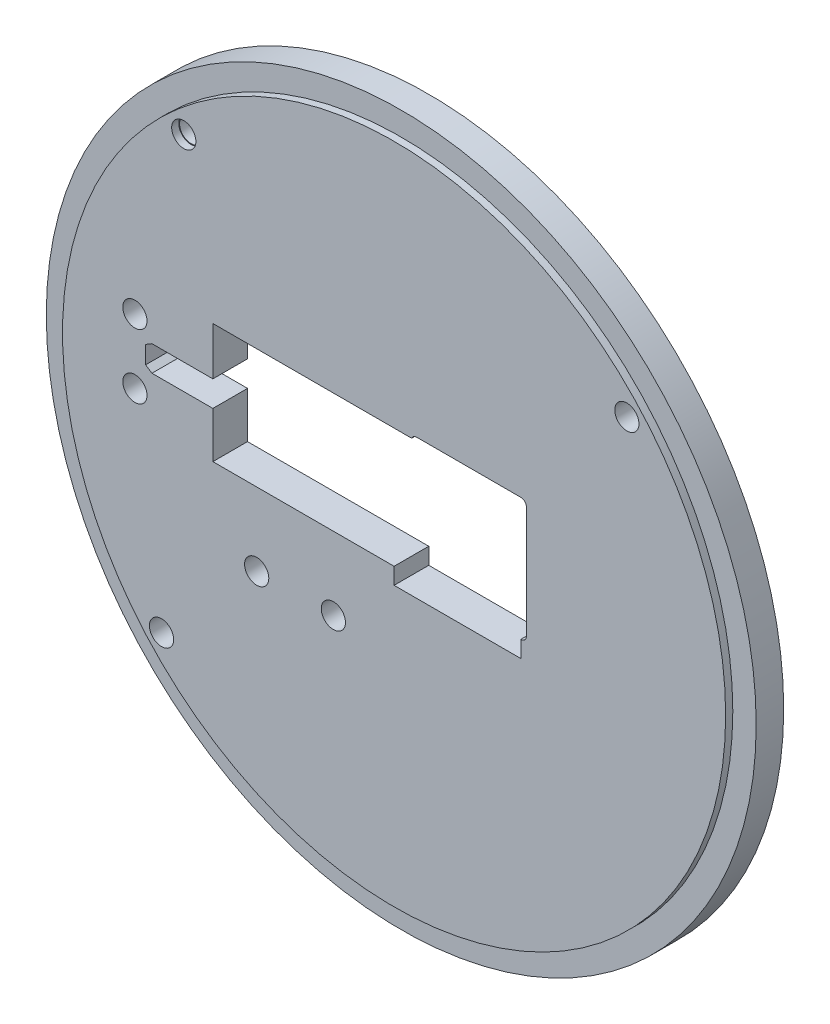
ISO-10303-21;
HEADER;
FILE_DESCRIPTION(('STEP AP214'),'2;1');
FILE_NAME('part.step','',(''),(''),'','','');
FILE_SCHEMA(('AUTOMOTIVE_DESIGN { 1 0 10303 214 1 1 1 1 }'));
ENDSEC;
DATA;
#1=APPLICATION_CONTEXT('core data for automotive mechanical design processes');
#2=APPLICATION_PROTOCOL_DEFINITION('international standard','automotive_design',2000,#1);
#3=PRODUCT_CONTEXT('',#1,'mechanical');
#4=PRODUCT('Part','Part','',(#3));
#5=PRODUCT_RELATED_PRODUCT_CATEGORY('part','',(#4));
#6=PRODUCT_DEFINITION_FORMATION('','',#4);
#7=PRODUCT_DEFINITION_CONTEXT('part definition',#1,'design');
#8=PRODUCT_DEFINITION('design','',#6,#7);
#9=PRODUCT_DEFINITION_SHAPE('','',#8);
#10=(LENGTH_UNIT() NAMED_UNIT(*) SI_UNIT(.MILLI.,.METRE.));
#11=(NAMED_UNIT(*) PLANE_ANGLE_UNIT() SI_UNIT($,.RADIAN.));
#12=(NAMED_UNIT(*) SI_UNIT($,.STERADIAN.) SOLID_ANGLE_UNIT());
#13=UNCERTAINTY_MEASURE_WITH_UNIT(LENGTH_MEASURE(1.E-05),#10,'distance_accuracy_value','');
#14=(GEOMETRIC_REPRESENTATION_CONTEXT(3) GLOBAL_UNCERTAINTY_ASSIGNED_CONTEXT((#13)) GLOBAL_UNIT_ASSIGNED_CONTEXT((#10,
#11,#12)) REPRESENTATION_CONTEXT('',''));
#15=CARTESIAN_POINT('',(0.,0.,0.));
#16=DIRECTION('',(0.,0.,1.));
#17=DIRECTION('',(1.,0.,0.));
#18=AXIS2_PLACEMENT_3D('',#15,#16,#17);
#19=CARTESIAN_POINT('',(0.,0.,1.3));
#20=DIRECTION('',(0.,0.,1.));
#21=DIRECTION('',(1.,0.,0.));
#22=AXIS2_PLACEMENT_3D('',#19,#20,#21);
#23=PLANE('',#22);
#24=DIRECTION('',(0.,-1.,0.));
#25=VECTOR('',#24,1.);
#26=CARTESIAN_POINT('',(-32.9284488261139,-6.63792462055282,1.3));
#27=LINE('',#26,#25);
#28=CARTESIAN_POINT('',(-32.9284488261139,15.1034870814472,1.3));
#29=VERTEX_POINT('',#28);
#30=CARTESIAN_POINT('',(-32.9284488261139,6.38776102905477,1.3));
#31=VERTEX_POINT('',#30);
#32=EDGE_CURVE('E156',#29,#31,#27,.T.);
#33=ORIENTED_EDGE('',*,*,#32,.F.);
#34=DIRECTION('',(-1.,0.,0.));
#35=VECTOR('',#34,1.);
#36=CARTESIAN_POINT('',(-4.87541319811387,15.1034870814472,1.3));
#37=LINE('',#36,#35);
#38=CARTESIAN_POINT('',(3.18719167966723,15.1034870814472,1.3));
#39=VERTEX_POINT('',#38);
#40=EDGE_CURVE('E160',#39,#29,#37,.T.);
#41=ORIENTED_EDGE('',*,*,#40,.F.);
#42=CARTESIAN_POINT('',(4.13147814388534,14.6913666814466,1.3));
#43=DIRECTION('',(0.,0.,1.));
#44=DIRECTION('',(-1.,0.,0.));
#45=AXIS2_PLACEMENT_3D('',#42,#43,#44);
#46=CIRCLE('',#45,1.03030100000056);
#47=CARTESIAN_POINT('',(4.13147814388613,15.7216676814472,1.3));
#48=VERTEX_POINT('',#47);
#49=EDGE_CURVE('E177',#48,#39,#46,.T.);
#50=ORIENTED_EDGE('',*,*,#49,.F.);
#51=DIRECTION('',(-1.,0.,0.));
#52=VECTOR('',#51,1.);
#53=CARTESIAN_POINT('',(4.13147814388613,15.7216676814472,1.3));
#54=LINE('',#53,#52);
#55=CARTESIAN_POINT('',(23.0168954738861,15.7216676814472,1.3));
#56=VERTEX_POINT('',#55);
#57=EDGE_CURVE('E296',#56,#48,#54,.T.);
#58=ORIENTED_EDGE('',*,*,#57,.F.);
#59=CARTESIAN_POINT('',(23.0168954738861,14.6913666814472,1.3));
#60=DIRECTION('',(0.,0.,1.));
#61=DIRECTION('',(-1.,0.,0.));
#62=AXIS2_PLACEMENT_3D('',#59,#60,#61);
#63=CIRCLE('',#62,1.030301);
#64=CARTESIAN_POINT('',(24.0471964738861,14.6913666814472,1.3));
#65=VERTEX_POINT('',#64);
#66=EDGE_CURVE('E293',#65,#56,#63,.T.);
#67=ORIENTED_EDGE('',*,*,#66,.F.);
#68=DIRECTION('',(0.,1.,0.));
#69=VECTOR('',#68,1.);
#70=CARTESIAN_POINT('',(24.0471964738861,14.6913666814472,1.3));
#71=LINE('',#70,#69);
#72=CARTESIAN_POINT('',(24.0471964738861,-5.60762362055281,1.3));
#73=VERTEX_POINT('',#72);
#74=EDGE_CURVE('E290',#73,#65,#71,.T.);
#75=ORIENTED_EDGE('',*,*,#74,.F.);
#76=CARTESIAN_POINT('',(23.0168954738861,-5.60762362055282,1.3));
#77=DIRECTION('',(0.,0.,1.));
#78=DIRECTION('',(-1.,0.,0.));
#79=AXIS2_PLACEMENT_3D('',#76,#77,#78);
#80=CIRCLE('',#79,1.030301);
#81=CARTESIAN_POINT('',(23.0168954738861,-6.63792462055282,1.3));
#82=VERTEX_POINT('',#81);
#83=EDGE_CURVE('E287',#82,#73,#80,.T.);
#84=ORIENTED_EDGE('',*,*,#83,.F.);
#85=DIRECTION('',(0.,-1.,0.));
#86=VECTOR('',#85,1.);
#87=CARTESIAN_POINT('',(23.0168954738861,-6.63792462055282,1.3));
#88=LINE('',#87,#86);
#89=CARTESIAN_POINT('',(23.0168954738861,-9.63884572019058,1.3));
#90=VERTEX_POINT('',#89);
#91=EDGE_CURVE('E186',#82,#90,#88,.T.);
#92=ORIENTED_EDGE('',*,*,#91,.T.);
#93=DIRECTION('',(-1.,0.,0.));
#94=VECTOR('',#93,1.);
#95=CARTESIAN_POINT('',(23.0168954738861,-9.63884572019058,1.3));
#96=LINE('',#95,#94);
#97=CARTESIAN_POINT('',(0.,-9.63884572019058,1.3));
#98=VERTEX_POINT('',#97);
#99=EDGE_CURVE('E189',#90,#98,#96,.T.);
#100=ORIENTED_EDGE('',*,*,#99,.T.);
#101=DIRECTION('',(0.,1.,0.));
#102=VECTOR('',#101,1.);
#103=CARTESIAN_POINT('',(0.,-6.63792462055282,1.3));
#104=LINE('',#103,#102);
#105=CARTESIAN_POINT('',(0.,-6.63792462055282,1.3));
#106=VERTEX_POINT('',#105);
#107=EDGE_CURVE('E192',#98,#106,#104,.T.);
#108=ORIENTED_EDGE('',*,*,#107,.T.);
#109=DIRECTION('',(1.,0.,0.));
#110=VECTOR('',#109,1.);
#111=CARTESIAN_POINT('',(23.0168954738861,-6.63792462055282,1.3));
#112=LINE('',#111,#110);
#113=CARTESIAN_POINT('',(-32.9284488261139,-6.63792462055282,1.3));
#114=VERTEX_POINT('',#113);
#115=EDGE_CURVE('E166',#114,#106,#112,.T.);
#116=ORIENTED_EDGE('',*,*,#115,.F.);
#117=CARTESIAN_POINT('',(-32.9284488261139,1.73888754700785,1.3));
#118=VERTEX_POINT('',#117);
#119=EDGE_CURVE('E167',#118,#114,#27,.T.);
#120=ORIENTED_EDGE('',*,*,#119,.F.);
#121=DIRECTION('',(0.999999994824188,0.000101742931272847,0.));
#122=VECTOR('',#121,1.);
#123=CARTESIAN_POINT('',(-0.000177260378193986,1.74223776589604,1.3));
#124=LINE('',#123,#122);
#125=CARTESIAN_POINT('',(-44.0006474856084,1.73776102905477,1.3));
#126=VERTEX_POINT('',#125);
#127=EDGE_CURVE('E229',#126,#118,#124,.T.);
#128=ORIENTED_EDGE('',*,*,#127,.F.);
#129=DIRECTION('',(0.842714728514668,-0.538360368474918,0.));
#130=VECTOR('',#129,1.);
#131=CARTESIAN_POINT('',(-11.9643959184329,-18.7282965995554,1.3));
#132=LINE('',#131,#130);
#133=CARTESIAN_POINT('',(-45.1560921053655,2.47590594357547,1.3));
#134=VERTEX_POINT('',#133);
#135=EDGE_CURVE('E231',#134,#126,#132,.T.);
#136=ORIENTED_EDGE('',*,*,#135,.F.);
#137=DIRECTION('',(0.015508629366864,-0.999879733975622,0.));
#138=VECTOR('',#137,1.);
#139=CARTESIAN_POINT('',(-45.1068379814891,-0.699629373809423,1.3));
#140=LINE('',#139,#138);
#141=CARTESIAN_POINT('',(-45.2055464495837,5.66434996213803,1.3));
#142=VERTEX_POINT('',#141);
#143=EDGE_CURVE('E234',#142,#134,#140,.T.);
#144=ORIENTED_EDGE('',*,*,#143,.F.);
#145=DIRECTION('',(-0.857344818331885,-0.514742520566804,0.));
#146=VECTOR('',#145,1.);
#147=CARTESIAN_POINT('',(-14.4774000339066,24.1132671307592,1.3));
#148=LINE('',#147,#146);
#149=CARTESIAN_POINT('',(-44.0006474856084,6.38776102905477,1.3));
#150=VERTEX_POINT('',#149);
#151=EDGE_CURVE('E236',#150,#142,#148,.T.);
#152=ORIENTED_EDGE('',*,*,#151,.F.);
#153=DIRECTION('',(-1.,0.,0.));
#154=VECTOR('',#153,1.);
#155=CARTESIAN_POINT('',(0.,6.38776102905477,1.3));
#156=LINE('',#155,#154);
#157=EDGE_CURVE('E162',#31,#150,#156,.T.);
#158=ORIENTED_EDGE('',*,*,#157,.F.);
#159=EDGE_LOOP('',(#33,#41,#50,#58,#67,#75,#84,#92,#100,#108,#116,#120,#128,#136,#144,#152,#158));
#160=FACE_BOUND('',#159,.T.);
#161=CARTESIAN_POINT('',(-11.0364763425701,-19.9160336647623,1.3));
#162=DIRECTION('',(0.,0.,1.));
#163=DIRECTION('',(1.,0.,0.));
#164=AXIS2_PLACEMENT_3D('',#161,#162,#163);
#165=CIRCLE('',#164,2.2);
#166=CARTESIAN_POINT('',(-8.83647634257007,-19.9160336647623,1.3));
#167=VERTEX_POINT('',#166);
#168=EDGE_CURVE('E201',#167,#167,#165,.T.);
#169=ORIENTED_EDGE('',*,*,#168,.F.);
#170=EDGE_LOOP('',(#169));
#171=FACE_BOUND('',#170,.T.);
#172=CARTESIAN_POINT('',(-24.9670551488254,-19.9160336647623,1.3));
#173=DIRECTION('',(0.,0.,1.));
#174=DIRECTION('',(1.,0.,0.));
#175=AXIS2_PLACEMENT_3D('',#172,#173,#174);
#176=CIRCLE('',#175,2.2);
#177=CARTESIAN_POINT('',(-22.7670551488254,-19.9160336647623,1.3));
#178=VERTEX_POINT('',#177);
#179=EDGE_CURVE('E215',#178,#178,#176,.T.);
#180=ORIENTED_EDGE('',*,*,#179,.F.);
#181=EDGE_LOOP('',(#180));
#182=FACE_BOUND('',#181,.T.);
#183=CARTESIAN_POINT('',(-47.0969630831013,9.4987656515056,1.3));
#184=DIRECTION('',(0.,0.,1.));
#185=DIRECTION('',(1.,0.,0.));
#186=AXIS2_PLACEMENT_3D('',#183,#184,#185);
#187=CIRCLE('',#186,2.2);
#188=CARTESIAN_POINT('',(-44.8969630831013,9.4987656515056,1.3));
#189=VERTEX_POINT('',#188);
#190=EDGE_CURVE('E209',#189,#189,#187,.T.);
#191=ORIENTED_EDGE('',*,*,#190,.F.);
#192=EDGE_LOOP('',(#191));
#193=FACE_BOUND('',#192,.T.);
#194=CARTESIAN_POINT('',(-47.0969630831013,-2.21617081107341,1.3));
#195=DIRECTION('',(0.,0.,1.));
#196=DIRECTION('',(1.,0.,0.));
#197=AXIS2_PLACEMENT_3D('',#194,#195,#196);
#198=CIRCLE('',#197,2.2);
#199=CARTESIAN_POINT('',(-44.8969630831013,-2.21617081107341,1.3));
#200=VERTEX_POINT('',#199);
#201=EDGE_CURVE('E208',#200,#200,#198,.T.);
#202=ORIENTED_EDGE('',*,*,#201,.F.);
#203=EDGE_LOOP('',(#202));
#204=FACE_BOUND('',#203,.T.);
#205=CARTESIAN_POINT('',(42.2958548521122,38.0024696441998,1.3));
#206=DIRECTION('',(0.,0.,1.));
#207=DIRECTION('',(1.,0.,0.));
#208=AXIS2_PLACEMENT_3D('',#205,#206,#207);
#209=CIRCLE('',#208,2.2);
#210=CARTESIAN_POINT('',(44.4958548521122,38.0024696441998,1.3));
#211=VERTEX_POINT('',#210);
#212=EDGE_CURVE('E344',#211,#211,#209,.F.);
#213=ORIENTED_EDGE('',*,*,#212,.T.);
#214=EDGE_LOOP('',(#213));
#215=FACE_BOUND('',#214,.T.);
#216=CARTESIAN_POINT('',(-42.2580512350063,-38.2129516282556,1.3));
#217=DIRECTION('',(0.,0.,1.));
#218=DIRECTION('',(1.,0.,0.));
#219=AXIS2_PLACEMENT_3D('',#216,#217,#218);
#220=CIRCLE('',#219,2.2);
#221=CARTESIAN_POINT('',(-40.0580512350063,-38.2129516282556,1.3));
#222=VERTEX_POINT('',#221);
#223=EDGE_CURVE('E351',#222,#222,#220,.F.);
#224=ORIENTED_EDGE('',*,*,#223,.T.);
#225=EDGE_LOOP('',(#224));
#226=FACE_BOUND('',#225,.T.);
#227=CARTESIAN_POINT('',(-38.2159534678941,42.1859171726915,1.3));
#228=DIRECTION('',(0.,0.,1.));
#229=DIRECTION('',(1.,0.,0.));
#230=AXIS2_PLACEMENT_3D('',#227,#228,#229);
#231=CIRCLE('',#230,2.2);
#232=CARTESIAN_POINT('',(-36.0159534678941,42.1859171726915,1.3));
#233=VERTEX_POINT('',#232);
#234=EDGE_CURVE('E339',#233,#233,#231,.F.);
#235=ORIENTED_EDGE('',*,*,#234,.T.);
#236=EDGE_LOOP('',(#235));
#237=FACE_BOUND('',#236,.T.);
#238=CARTESIAN_POINT('',(0.,0.,1.3));
#239=DIRECTION('',(0.,0.,1.));
#240=DIRECTION('',(1.,0.,0.));
#241=AXIS2_PLACEMENT_3D('',#238,#239,#240);
#242=CIRCLE('',#241,60.25);
#243=CARTESIAN_POINT('',(60.25,0.,1.3));
#244=VERTEX_POINT('',#243);
#245=EDGE_CURVE('E11',#244,#244,#242,.T.);
#246=ORIENTED_EDGE('',*,*,#245,.T.);
#247=EDGE_LOOP('',(#246));
#248=FACE_BOUND('',#247,.T.);
#249=ADVANCED_FACE('F33',(#160,#171,#182,#193,#204,#215,#226,#237,#248),#23,.T.);
#250=CARTESIAN_POINT('',(0.,0.,-5.));
#251=DIRECTION('',(0.,0.,-1.));
#252=DIRECTION('',(-1.,0.,0.));
#253=AXIS2_PLACEMENT_3D('',#250,#251,#252);
#254=PLANE('',#253);
#255=DIRECTION('',(-1.,0.,0.));
#256=VECTOR('',#255,1.);
#257=CARTESIAN_POINT('',(-4.87541319811387,15.1034870814472,-5.));
#258=LINE('',#257,#256);
#259=CARTESIAN_POINT('',(3.18719167966723,15.1034870814472,-5.));
#260=VERTEX_POINT('',#259);
#261=CARTESIAN_POINT('',(-32.9284488261139,15.1034870814472,-5.));
#262=VERTEX_POINT('',#261);
#263=EDGE_CURVE('E282',#260,#262,#258,.T.);
#264=ORIENTED_EDGE('',*,*,#263,.T.);
#265=DIRECTION('',(0.,-1.,0.));
#266=VECTOR('',#265,1.);
#267=CARTESIAN_POINT('',(-32.9284488261139,-6.63792462055282,-5.));
#268=LINE('',#267,#266);
#269=CARTESIAN_POINT('',(-32.9284488261139,6.38776102905477,-5.));
#270=VERTEX_POINT('',#269);
#271=EDGE_CURVE('E58',#262,#270,#268,.T.);
#272=ORIENTED_EDGE('',*,*,#271,.T.);
#273=DIRECTION('',(-1.,0.,0.));
#274=VECTOR('',#273,1.);
#275=CARTESIAN_POINT('',(0.,6.38776102905477,-5.));
#276=LINE('',#275,#274);
#277=CARTESIAN_POINT('',(-44.0006474856084,6.38776102905477,-5.));
#278=VERTEX_POINT('',#277);
#279=EDGE_CURVE('E232',#270,#278,#276,.T.);
#280=ORIENTED_EDGE('',*,*,#279,.T.);
#281=DIRECTION('',(-0.857344818331885,-0.514742520566804,0.));
#282=VECTOR('',#281,1.);
#283=CARTESIAN_POINT('',(-14.4774000339066,24.1132671307592,-5.));
#284=LINE('',#283,#282);
#285=CARTESIAN_POINT('',(-45.2055464495837,5.66434996213803,-5.));
#286=VERTEX_POINT('',#285);
#287=EDGE_CURVE('E248',#278,#286,#284,.T.);
#288=ORIENTED_EDGE('',*,*,#287,.T.);
#289=DIRECTION('',(0.015508629366864,-0.999879733975622,0.));
#290=VECTOR('',#289,1.);
#291=CARTESIAN_POINT('',(-45.1068379814891,-0.699629373809423,-5.));
#292=LINE('',#291,#290);
#293=CARTESIAN_POINT('',(-45.1560921053655,2.47590594357547,-5.));
#294=VERTEX_POINT('',#293);
#295=EDGE_CURVE('E245',#286,#294,#292,.T.);
#296=ORIENTED_EDGE('',*,*,#295,.T.);
#297=DIRECTION('',(0.842714728514668,-0.538360368474918,0.));
#298=VECTOR('',#297,1.);
#299=CARTESIAN_POINT('',(-11.9643959184329,-18.7282965995554,-5.));
#300=LINE('',#299,#298);
#301=CARTESIAN_POINT('',(-44.0006474856084,1.73776102905477,-5.));
#302=VERTEX_POINT('',#301);
#303=EDGE_CURVE('E242',#294,#302,#300,.T.);
#304=ORIENTED_EDGE('',*,*,#303,.T.);
#305=DIRECTION('',(0.999999994824188,0.000101742931272847,0.));
#306=VECTOR('',#305,1.);
#307=CARTESIAN_POINT('',(-0.000177260378193986,1.74223776589604,-5.));
#308=LINE('',#307,#306);
#309=CARTESIAN_POINT('',(-32.9284488261139,1.73888754700785,-5.));
#310=VERTEX_POINT('',#309);
#311=EDGE_CURVE('E226',#302,#310,#308,.T.);
#312=ORIENTED_EDGE('',*,*,#311,.T.);
#313=CARTESIAN_POINT('',(-32.9284488261139,-6.63792462055282,-5.));
#314=VERTEX_POINT('',#313);
#315=EDGE_CURVE('E176',#310,#314,#268,.T.);
#316=ORIENTED_EDGE('',*,*,#315,.T.);
#317=DIRECTION('',(1.,0.,0.));
#318=VECTOR('',#317,1.);
#319=CARTESIAN_POINT('',(23.0168954738861,-6.63792462055282,-5.));
#320=LINE('',#319,#318);
#321=CARTESIAN_POINT('',(0.,-6.63792462055282,-5.));
#322=VERTEX_POINT('',#321);
#323=EDGE_CURVE('E264',#314,#322,#320,.T.);
#324=ORIENTED_EDGE('',*,*,#323,.T.);
#325=DIRECTION('',(0.,1.,0.));
#326=VECTOR('',#325,1.);
#327=CARTESIAN_POINT('',(0.,-6.63792462055282,-5.));
#328=LINE('',#327,#326);
#329=CARTESIAN_POINT('',(0.,-9.63884572019058,-5.));
#330=VERTEX_POINT('',#329);
#331=EDGE_CURVE('E50',#330,#322,#328,.T.);
#332=ORIENTED_EDGE('',*,*,#331,.F.);
#333=DIRECTION('',(-1.,0.,0.));
#334=VECTOR('',#333,1.);
#335=CARTESIAN_POINT('',(23.0168954738861,-9.63884572019058,-5.));
#336=LINE('',#335,#334);
#337=CARTESIAN_POINT('',(23.0168954738861,-9.63884572019058,-5.));
#338=VERTEX_POINT('',#337);
#339=EDGE_CURVE('E183',#338,#330,#336,.T.);
#340=ORIENTED_EDGE('',*,*,#339,.F.);
#341=DIRECTION('',(0.,-1.,0.));
#342=VECTOR('',#341,1.);
#343=CARTESIAN_POINT('',(23.0168954738861,-6.63792462055282,-5.));
#344=LINE('',#343,#342);
#345=CARTESIAN_POINT('',(23.0168954738861,-6.63792462055282,-5.));
#346=VERTEX_POINT('',#345);
#347=EDGE_CURVE('E180',#346,#338,#344,.T.);
#348=ORIENTED_EDGE('',*,*,#347,.F.);
#349=CARTESIAN_POINT('',(23.0168954738861,-5.60762362055282,-5.));
#350=DIRECTION('',(0.,0.,1.));
#351=DIRECTION('',(-1.,0.,0.));
#352=AXIS2_PLACEMENT_3D('',#349,#350,#351);
#353=CIRCLE('',#352,1.030301);
#354=CARTESIAN_POINT('',(24.0471964738861,-5.60762362055281,-5.));
#355=VERTEX_POINT('',#354);
#356=EDGE_CURVE('E267',#346,#355,#353,.T.);
#357=ORIENTED_EDGE('',*,*,#356,.T.);
#358=DIRECTION('',(0.,1.,0.));
#359=VECTOR('',#358,1.);
#360=CARTESIAN_POINT('',(24.0471964738861,14.6913666814472,-5.));
#361=LINE('',#360,#359);
#362=CARTESIAN_POINT('',(24.0471964738861,14.6913666814472,-5.));
#363=VERTEX_POINT('',#362);
#364=EDGE_CURVE('E270',#355,#363,#361,.T.);
#365=ORIENTED_EDGE('',*,*,#364,.T.);
#366=CARTESIAN_POINT('',(23.0168954738861,14.6913666814472,-5.));
#367=DIRECTION('',(0.,0.,1.));
#368=DIRECTION('',(-1.,0.,0.));
#369=AXIS2_PLACEMENT_3D('',#366,#367,#368);
#370=CIRCLE('',#369,1.030301);
#371=CARTESIAN_POINT('',(23.0168954738861,15.7216676814472,-5.));
#372=VERTEX_POINT('',#371);
#373=EDGE_CURVE('E273',#363,#372,#370,.T.);
#374=ORIENTED_EDGE('',*,*,#373,.T.);
#375=DIRECTION('',(-1.,0.,0.));
#376=VECTOR('',#375,1.);
#377=CARTESIAN_POINT('',(4.13147814388613,15.7216676814472,-5.));
#378=LINE('',#377,#376);
#379=CARTESIAN_POINT('',(4.13147814388613,15.7216676814472,-5.));
#380=VERTEX_POINT('',#379);
#381=EDGE_CURVE('E276',#372,#380,#378,.T.);
#382=ORIENTED_EDGE('',*,*,#381,.T.);
#383=CARTESIAN_POINT('',(4.13147814388534,14.6913666814466,-5.));
#384=DIRECTION('',(0.,0.,1.));
#385=DIRECTION('',(-1.,0.,0.));
#386=AXIS2_PLACEMENT_3D('',#383,#384,#385);
#387=CIRCLE('',#386,1.03030100000056);
#388=EDGE_CURVE('E279',#380,#260,#387,.T.);
#389=ORIENTED_EDGE('',*,*,#388,.T.);
#390=EDGE_LOOP('',(#264,#272,#280,#288,#296,#304,#312,#316,#324,#332,#340,#348,#357,#365,#374,
#382,#389));
#391=FACE_BOUND('',#390,.T.);
#392=CARTESIAN_POINT('',(-11.0364763425701,-19.9160336647623,-5.));
#393=DIRECTION('',(0.,0.,1.));
#394=DIRECTION('',(1.,0.,0.));
#395=AXIS2_PLACEMENT_3D('',#392,#393,#394);
#396=CIRCLE('',#395,2.2);
#397=CARTESIAN_POINT('',(-8.83647634257007,-19.9160336647623,-5.));
#398=VERTEX_POINT('',#397);
#399=EDGE_CURVE('E218',#398,#398,#396,.T.);
#400=ORIENTED_EDGE('',*,*,#399,.T.);
#401=EDGE_LOOP('',(#400));
#402=FACE_BOUND('',#401,.T.);
#403=CARTESIAN_POINT('',(-24.9670551488254,-19.9160336647623,-5.));
#404=DIRECTION('',(0.,0.,1.));
#405=DIRECTION('',(1.,0.,0.));
#406=AXIS2_PLACEMENT_3D('',#403,#404,#405);
#407=CIRCLE('',#406,2.2);
#408=CARTESIAN_POINT('',(-22.7670551488254,-19.9160336647623,-5.));
#409=VERTEX_POINT('',#408);
#410=EDGE_CURVE('E212',#409,#409,#407,.T.);
#411=ORIENTED_EDGE('',*,*,#410,.T.);
#412=EDGE_LOOP('',(#411));
#413=FACE_BOUND('',#412,.T.);
#414=CARTESIAN_POINT('',(-47.0969630831013,9.4987656515056,-5.));
#415=DIRECTION('',(0.,0.,1.));
#416=DIRECTION('',(1.,0.,0.));
#417=AXIS2_PLACEMENT_3D('',#414,#415,#416);
#418=CIRCLE('',#417,2.2);
#419=CARTESIAN_POINT('',(-44.8969630831013,9.4987656515056,-5.));
#420=VERTEX_POINT('',#419);
#421=EDGE_CURVE('E205',#420,#420,#418,.T.);
#422=ORIENTED_EDGE('',*,*,#421,.T.);
#423=EDGE_LOOP('',(#422));
#424=FACE_BOUND('',#423,.T.);
#425=CARTESIAN_POINT('',(-47.0969630831013,-2.21617081107341,-5.));
#426=DIRECTION('',(0.,0.,1.));
#427=DIRECTION('',(1.,0.,0.));
#428=AXIS2_PLACEMENT_3D('',#425,#426,#427);
#429=CIRCLE('',#428,2.2);
#430=CARTESIAN_POINT('',(-44.8969630831013,-2.21617081107341,-5.));
#431=VERTEX_POINT('',#430);
#432=EDGE_CURVE('E223',#431,#431,#429,.T.);
#433=ORIENTED_EDGE('',*,*,#432,.T.);
#434=EDGE_LOOP('',(#433));
#435=FACE_BOUND('',#434,.T.);
#436=CARTESIAN_POINT('',(42.2958548521122,38.0024696441998,-5.));
#437=DIRECTION('',(0.,0.,-1.));
#438=DIRECTION('',(-1.,0.,0.));
#439=AXIS2_PLACEMENT_3D('',#436,#437,#438);
#440=CIRCLE('',#439,3.55);
#441=CARTESIAN_POINT('',(38.7458548521122,38.0024696441998,-5.));
#442=VERTEX_POINT('',#441);
#443=EDGE_CURVE('E319',#442,#442,#440,.T.);
#444=ORIENTED_EDGE('',*,*,#443,.F.);
#445=EDGE_LOOP('',(#444));
#446=FACE_BOUND('',#445,.T.);
#447=CARTESIAN_POINT('',(-38.2159534678941,42.1859171726915,-5.));
#448=DIRECTION('',(0.,0.,-1.));
#449=DIRECTION('',(-1.,0.,0.));
#450=AXIS2_PLACEMENT_3D('',#447,#448,#449);
#451=CIRCLE('',#450,3.55);
#452=CARTESIAN_POINT('',(-41.7659534678941,42.1859171726915,-5.));
#453=VERTEX_POINT('',#452);
#454=EDGE_CURVE('E325',#453,#453,#451,.T.);
#455=ORIENTED_EDGE('',*,*,#454,.F.);
#456=EDGE_LOOP('',(#455));
#457=FACE_BOUND('',#456,.T.);
#458=CARTESIAN_POINT('',(-42.2580512350063,-38.2129516282556,-5.));
#459=DIRECTION('',(0.,0.,-1.));
#460=DIRECTION('',(-1.,0.,0.));
#461=AXIS2_PLACEMENT_3D('',#458,#459,#460);
#462=CIRCLE('',#461,3.55);
#463=CARTESIAN_POINT('',(-45.8080512350063,-38.2129516282556,-5.));
#464=VERTEX_POINT('',#463);
#465=EDGE_CURVE('E301',#464,#464,#462,.T.);
#466=ORIENTED_EDGE('',*,*,#465,.F.);
#467=EDGE_LOOP('',(#466));
#468=FACE_BOUND('',#467,.T.);
#469=CARTESIAN_POINT('',(0.,0.,-5.));
#470=DIRECTION('',(0.,0.,1.));
#471=DIRECTION('',(1.,0.,0.));
#472=AXIS2_PLACEMENT_3D('',#469,#470,#471);
#473=CIRCLE('',#472,64.5);
#474=CARTESIAN_POINT('',(64.5,0.,-5.));
#475=VERTEX_POINT('',#474);
#476=EDGE_CURVE('E42',#475,#475,#473,.T.);
#477=ORIENTED_EDGE('',*,*,#476,.F.);
#478=EDGE_LOOP('',(#477));
#479=FACE_BOUND('',#478,.T.);
#480=ADVANCED_FACE('F379',(#391,#402,#413,#424,#435,#446,#457,#468,#479),#254,.T.);
#481=CARTESIAN_POINT('',(-32.9284488261139,-6.63792462055282,-5.));
#482=DIRECTION('',(-1.,0.,0.));
#483=DIRECTION('',(0.,-1.,0.));
#484=AXIS2_PLACEMENT_3D('',#481,#482,#483);
#485=PLANE('',#484);
#486=DIRECTION('',(0.,0.,-1.));
#487=VECTOR('',#486,1.);
#488=CARTESIAN_POINT('',(-32.9284488261139,1.73888754700785,1.3));
#489=LINE('',#488,#487);
#490=EDGE_CURVE('E252',#118,#310,#489,.T.);
#491=ORIENTED_EDGE('',*,*,#490,.F.);
#492=ORIENTED_EDGE('',*,*,#119,.T.);
#493=DIRECTION('',(0.,0.,1.));
#494=VECTOR('',#493,1.);
#495=CARTESIAN_POINT('',(-32.9284488261139,-6.63792462055282,-5.));
#496=LINE('',#495,#494);
#497=EDGE_CURVE('E283',#314,#114,#496,.T.);
#498=ORIENTED_EDGE('',*,*,#497,.F.);
#499=ORIENTED_EDGE('',*,*,#315,.F.);
#500=EDGE_LOOP('',(#491,#492,#498,#499));
#501=FACE_BOUND('',#500,.T.);
#502=ADVANCED_FACE('F382',(#501),#485,.F.);
#503=DIRECTION('',(0.,0.,-1.));
#504=VECTOR('',#503,1.);
#505=CARTESIAN_POINT('',(-32.9284488261139,6.38776102905477,1.3));
#506=LINE('',#505,#504);
#507=EDGE_CURVE('E254',#31,#270,#506,.T.);
#508=ORIENTED_EDGE('',*,*,#507,.T.);
#509=ORIENTED_EDGE('',*,*,#271,.F.);
#510=DIRECTION('',(0.,0.,1.));
#511=VECTOR('',#510,1.);
#512=CARTESIAN_POINT('',(-32.9284488261139,15.1034870814472,-5.));
#513=LINE('',#512,#511);
#514=EDGE_CURVE('E173',#262,#29,#513,.T.);
#515=ORIENTED_EDGE('',*,*,#514,.T.);
#516=ORIENTED_EDGE('',*,*,#32,.T.);
#517=EDGE_LOOP('',(#508,#509,#515,#516));
#518=FACE_BOUND('',#517,.T.);
#519=ADVANCED_FACE('F179',(#518),#485,.F.);
#520=CARTESIAN_POINT('',(-42.2580512350063,-38.2129516282556,22.55));
#521=DIRECTION('',(0.,0.,-1.));
#522=DIRECTION('',(-1.,0.,0.));
#523=AXIS2_PLACEMENT_3D('',#520,#521,#522);
#524=CYLINDRICAL_SURFACE('',#523,2.2);
#525=ORIENTED_EDGE('',*,*,#223,.F.);
#526=EDGE_LOOP('',(#525));
#527=FACE_BOUND('',#526,.T.);
#528=CARTESIAN_POINT('',(-42.2580512350063,-38.2129516282556,-2.));
#529=DIRECTION('',(0.,0.,-1.));
#530=DIRECTION('',(-1.,0.,0.));
#531=AXIS2_PLACEMENT_3D('',#528,#529,#530);
#532=CIRCLE('',#531,2.2);
#533=CARTESIAN_POINT('',(-44.4580512350063,-38.2129516282556,-2.));
#534=VERTEX_POINT('',#533);
#535=EDGE_CURVE('E37',#534,#534,#532,.T.);
#536=ORIENTED_EDGE('',*,*,#535,.T.);
#537=EDGE_LOOP('',(#536));
#538=FACE_BOUND('',#537,.T.);
#539=ADVANCED_FACE('F364',(#527,#538),#524,.F.);
#540=CARTESIAN_POINT('',(42.2958548521122,38.0024696441998,22.55));
#541=DIRECTION('',(0.,0.,-1.));
#542=DIRECTION('',(-1.,0.,0.));
#543=AXIS2_PLACEMENT_3D('',#540,#541,#542);
#544=CYLINDRICAL_SURFACE('',#543,2.2);
#545=ORIENTED_EDGE('',*,*,#212,.F.);
#546=EDGE_LOOP('',(#545));
#547=FACE_BOUND('',#546,.T.);
#548=CARTESIAN_POINT('',(42.2958548521122,38.0024696441998,-2.));
#549=DIRECTION('',(0.,0.,-1.));
#550=DIRECTION('',(-1.,0.,0.));
#551=AXIS2_PLACEMENT_3D('',#548,#549,#550);
#552=CIRCLE('',#551,2.2);
#553=CARTESIAN_POINT('',(40.0958548521122,38.0024696441998,-2.));
#554=VERTEX_POINT('',#553);
#555=EDGE_CURVE('E357',#554,#554,#552,.T.);
#556=ORIENTED_EDGE('',*,*,#555,.T.);
#557=EDGE_LOOP('',(#556));
#558=FACE_BOUND('',#557,.T.);
#559=ADVANCED_FACE('F615',(#547,#558),#544,.F.);
#560=CARTESIAN_POINT('',(-38.2159534678941,42.1859171726915,-5.));
#561=DIRECTION('',(0.,0.,1.));
#562=DIRECTION('',(1.,0.,0.));
#563=AXIS2_PLACEMENT_3D('',#560,#561,#562);
#564=CYLINDRICAL_SURFACE('',#563,2.06336924557249);
#565=CARTESIAN_POINT('',(-38.2159534678941,42.1859171726915,0.));
#566=DIRECTION('',(0.,0.,1.));
#567=DIRECTION('',(1.,0.,0.));
#568=AXIS2_PLACEMENT_3D('',#565,#566,#567);
#569=CIRCLE('',#568,2.06336924557249);
#570=CARTESIAN_POINT('',(-36.1525842223216,42.1859171726915,0.));
#571=VERTEX_POINT('',#570);
#572=EDGE_CURVE('E333',#571,#571,#569,.T.);
#573=ORIENTED_EDGE('',*,*,#572,.T.);
#574=EDGE_LOOP('',(#573));
#575=FACE_BOUND('',#574,.T.);
#576=CARTESIAN_POINT('',(-38.2159534678941,42.1859171726915,-2.));
#577=DIRECTION('',(0.,0.,-1.));
#578=DIRECTION('',(-1.,0.,0.));
#579=AXIS2_PLACEMENT_3D('',#576,#577,#578);
#580=CIRCLE('',#579,2.06336924557249);
#581=CARTESIAN_POINT('',(-40.2793227134666,42.1859171726915,-2.));
#582=VERTEX_POINT('',#581);
#583=EDGE_CURVE('E318',#582,#582,#580,.F.);
#584=ORIENTED_EDGE('',*,*,#583,.F.);
#585=EDGE_LOOP('',(#584));
#586=FACE_BOUND('',#585,.T.);
#587=ADVANCED_FACE('F612',(#575,#586),#564,.F.);
#588=CARTESIAN_POINT('',(0.,0.,1.3));
#589=DIRECTION('',(0.,0.,-1.));
#590=DIRECTION('',(-1.,0.,0.));
#591=AXIS2_PLACEMENT_3D('',#588,#589,#590);
#592=CYLINDRICAL_SURFACE('',#591,60.25);
#593=CARTESIAN_POINT('',(0.,0.,0.));
#594=DIRECTION('',(0.,0.,1.));
#595=DIRECTION('',(1.,0.,0.));
#596=AXIS2_PLACEMENT_3D('',#593,#594,#595);
#597=CIRCLE('',#596,60.25);
#598=CARTESIAN_POINT('',(60.25,0.,0.));
#599=VERTEX_POINT('',#598);
#600=EDGE_CURVE('E340',#599,#599,#597,.T.);
#601=ORIENTED_EDGE('',*,*,#600,.T.);
#602=EDGE_LOOP('',(#601));
#603=FACE_BOUND('',#602,.T.);
#604=ORIENTED_EDGE('',*,*,#245,.F.);
#605=EDGE_LOOP('',(#604));
#606=FACE_BOUND('',#605,.T.);
#607=ADVANCED_FACE('F35',(#603,#606),#592,.T.);
#608=CARTESIAN_POINT('',(0.,0.,-5.));
#609=DIRECTION('',(0.,0.,1.));
#610=DIRECTION('',(1.,0.,0.));
#611=AXIS2_PLACEMENT_3D('',#608,#609,#610);
#612=CYLINDRICAL_SURFACE('',#611,64.5);
#613=ORIENTED_EDGE('',*,*,#476,.T.);
#614=EDGE_LOOP('',(#613));
#615=FACE_BOUND('',#614,.T.);
#616=CARTESIAN_POINT('',(0.,0.,0.));
#617=DIRECTION('',(0.,0.,1.));
#618=DIRECTION('',(1.,0.,0.));
#619=AXIS2_PLACEMENT_3D('',#616,#617,#618);
#620=CIRCLE('',#619,64.5);
#621=CARTESIAN_POINT('',(64.5,0.,0.));
#622=VERTEX_POINT('',#621);
#623=EDGE_CURVE('E343',#622,#622,#620,.T.);
#624=ORIENTED_EDGE('',*,*,#623,.F.);
#625=EDGE_LOOP('',(#624));
#626=FACE_BOUND('',#625,.T.);
#627=ADVANCED_FACE('F386',(#615,#626),#612,.T.);
#628=CARTESIAN_POINT('',(0.,0.,0.));
#629=DIRECTION('',(0.,0.,1.));
#630=DIRECTION('',(1.,0.,0.));
#631=AXIS2_PLACEMENT_3D('',#628,#629,#630);
#632=PLANE('',#631);
#633=ORIENTED_EDGE('',*,*,#600,.F.);
#634=EDGE_LOOP('',(#633));
#635=FACE_BOUND('',#634,.T.);
#636=ORIENTED_EDGE('',*,*,#623,.T.);
#637=EDGE_LOOP('',(#636));
#638=FACE_BOUND('',#637,.T.);
#639=ADVANCED_FACE('F389',(#635,#638),#632,.T.);
#640=CARTESIAN_POINT('',(-38.2159534678941,42.1859171726915,22.55));
#641=DIRECTION('',(0.,0.,-1.));
#642=DIRECTION('',(-1.,0.,0.));
#643=AXIS2_PLACEMENT_3D('',#640,#641,#642);
#644=CYLINDRICAL_SURFACE('',#643,2.2);
#645=ORIENTED_EDGE('',*,*,#234,.F.);
#646=EDGE_LOOP('',(#645));
#647=FACE_BOUND('',#646,.T.);
#648=CARTESIAN_POINT('',(-38.2159534678941,42.1859171726915,0.));
#649=DIRECTION('',(0.,0.,1.));
#650=DIRECTION('',(1.,0.,0.));
#651=AXIS2_PLACEMENT_3D('',#648,#649,#650);
#652=CIRCLE('',#651,2.2);
#653=CARTESIAN_POINT('',(-36.0159534678941,42.1859171726915,0.));
#654=VERTEX_POINT('',#653);
#655=EDGE_CURVE('E336',#654,#654,#652,.T.);
#656=ORIENTED_EDGE('',*,*,#655,.F.);
#657=EDGE_LOOP('',(#656));
#658=FACE_BOUND('',#657,.T.);
#659=ADVANCED_FACE('F394',(#647,#658),#644,.F.);
#660=CARTESIAN_POINT('',(-38.2159534678941,42.1859171726915,0.));
#661=DIRECTION('',(0.,0.,1.));
#662=DIRECTION('',(1.,0.,0.));
#663=AXIS2_PLACEMENT_3D('',#660,#661,#662);
#664=PLANE('',#663);
#665=ORIENTED_EDGE('',*,*,#572,.F.);
#666=EDGE_LOOP('',(#665));
#667=FACE_BOUND('',#666,.T.);
#668=ORIENTED_EDGE('',*,*,#655,.T.);
#669=EDGE_LOOP('',(#668));
#670=FACE_BOUND('',#669,.T.);
#671=ADVANCED_FACE('F400',(#667,#670),#664,.T.);
#672=CARTESIAN_POINT('',(-38.2159534678941,42.1859171726915,-2.));
#673=DIRECTION('',(0.,0.,-1.));
#674=DIRECTION('',(-1.,0.,0.));
#675=AXIS2_PLACEMENT_3D('',#672,#673,#674);
#676=PLANE('',#675);
#677=CARTESIAN_POINT('',(-38.2159534678941,42.1859171726915,-2.));
#678=DIRECTION('',(0.,0.,-1.));
#679=DIRECTION('',(-1.,0.,0.));
#680=AXIS2_PLACEMENT_3D('',#677,#678,#679);
#681=CIRCLE('',#680,3.55);
#682=CARTESIAN_POINT('',(-41.7659534678941,42.1859171726915,-2.));
#683=VERTEX_POINT('',#682);
#684=EDGE_CURVE('E322',#683,#683,#681,.T.);
#685=ORIENTED_EDGE('',*,*,#684,.T.);
#686=EDGE_LOOP('',(#685));
#687=FACE_BOUND('',#686,.T.);
#688=ORIENTED_EDGE('',*,*,#583,.T.);
#689=EDGE_LOOP('',(#688));
#690=FACE_BOUND('',#689,.T.);
#691=ADVANCED_FACE('F605',(#687,#690),#676,.T.);
#692=CARTESIAN_POINT('',(-38.2159534678941,42.1859171726915,-2.));
#693=DIRECTION('',(0.,0.,-1.));
#694=DIRECTION('',(-1.,0.,0.));
#695=AXIS2_PLACEMENT_3D('',#692,#693,#694);
#696=CYLINDRICAL_SURFACE('',#695,3.55);
#697=ORIENTED_EDGE('',*,*,#684,.F.);
#698=EDGE_LOOP('',(#697));
#699=FACE_BOUND('',#698,.T.);
#700=ORIENTED_EDGE('',*,*,#454,.T.);
#701=EDGE_LOOP('',(#700));
#702=FACE_BOUND('',#701,.T.);
#703=ADVANCED_FACE('F603',(#699,#702),#696,.F.);
#704=CARTESIAN_POINT('',(42.2958548521122,38.0024696441998,-2.));
#705=DIRECTION('',(0.,0.,-1.));
#706=DIRECTION('',(-1.,0.,0.));
#707=AXIS2_PLACEMENT_3D('',#704,#705,#706);
#708=CYLINDRICAL_SURFACE('',#707,3.55);
#709=CARTESIAN_POINT('',(42.2958548521122,38.0024696441998,-2.));
#710=DIRECTION('',(0.,0.,-1.));
#711=DIRECTION('',(-1.,0.,0.));
#712=AXIS2_PLACEMENT_3D('',#709,#710,#711);
#713=CIRCLE('',#712,3.55);
#714=CARTESIAN_POINT('',(38.7458548521122,38.0024696441998,-2.));
#715=VERTEX_POINT('',#714);
#716=EDGE_CURVE('E315',#715,#715,#713,.T.);
#717=ORIENTED_EDGE('',*,*,#716,.F.);
#718=EDGE_LOOP('',(#717));
#719=FACE_BOUND('',#718,.T.);
#720=ORIENTED_EDGE('',*,*,#443,.T.);
#721=EDGE_LOOP('',(#720));
#722=FACE_BOUND('',#721,.T.);
#723=ADVANCED_FACE('F599',(#719,#722),#708,.F.);
#724=CARTESIAN_POINT('',(42.2958548521122,38.0024696441998,-2.));
#725=DIRECTION('',(0.,0.,-1.));
#726=DIRECTION('',(-1.,0.,0.));
#727=AXIS2_PLACEMENT_3D('',#724,#725,#726);
#728=PLANE('',#727);
#729=ORIENTED_EDGE('',*,*,#555,.F.);
#730=EDGE_LOOP('',(#729));
#731=FACE_BOUND('',#730,.T.);
#732=ORIENTED_EDGE('',*,*,#716,.T.);
#733=EDGE_LOOP('',(#732));
#734=FACE_BOUND('',#733,.T.);
#735=ADVANCED_FACE('F375',(#731,#734),#728,.T.);
#736=CARTESIAN_POINT('',(-42.2580512350063,-38.2129516282556,-2.));
#737=DIRECTION('',(0.,0.,-1.));
#738=DIRECTION('',(-1.,0.,0.));
#739=AXIS2_PLACEMENT_3D('',#736,#737,#738);
#740=CYLINDRICAL_SURFACE('',#739,3.55);
#741=CARTESIAN_POINT('',(-42.2580512350063,-38.2129516282556,-2.));
#742=DIRECTION('',(0.,0.,-1.));
#743=DIRECTION('',(-1.,0.,0.));
#744=AXIS2_PLACEMENT_3D('',#741,#742,#743);
#745=CIRCLE('',#744,3.55);
#746=CARTESIAN_POINT('',(-45.8080512350063,-38.2129516282556,-2.));
#747=VERTEX_POINT('',#746);
#748=EDGE_CURVE('E328',#747,#747,#745,.T.);
#749=ORIENTED_EDGE('',*,*,#748,.F.);
#750=EDGE_LOOP('',(#749));
#751=FACE_BOUND('',#750,.T.);
#752=ORIENTED_EDGE('',*,*,#465,.T.);
#753=EDGE_LOOP('',(#752));
#754=FACE_BOUND('',#753,.T.);
#755=ADVANCED_FACE('F369',(#751,#754),#740,.F.);
#756=CARTESIAN_POINT('',(-42.2580512350063,-38.2129516282556,-2.));
#757=DIRECTION('',(0.,0.,-1.));
#758=DIRECTION('',(-1.,0.,0.));
#759=AXIS2_PLACEMENT_3D('',#756,#757,#758);
#760=PLANE('',#759);
#761=ORIENTED_EDGE('',*,*,#535,.F.);
#762=EDGE_LOOP('',(#761));
#763=FACE_BOUND('',#762,.T.);
#764=ORIENTED_EDGE('',*,*,#748,.T.);
#765=EDGE_LOOP('',(#764));
#766=FACE_BOUND('',#765,.T.);
#767=ADVANCED_FACE('F366',(#763,#766),#760,.T.);
#768=CARTESIAN_POINT('',(-4.87541319811387,15.1034870814472,-5.));
#769=DIRECTION('',(0.,1.,0.));
#770=DIRECTION('',(0.,0.,1.));
#771=AXIS2_PLACEMENT_3D('',#768,#769,#770);
#772=PLANE('',#771);
#773=ORIENTED_EDGE('',*,*,#40,.T.);
#774=ORIENTED_EDGE('',*,*,#514,.F.);
#775=ORIENTED_EDGE('',*,*,#263,.F.);
#776=DIRECTION('',(0.,0.,1.));
#777=VECTOR('',#776,1.);
#778=CARTESIAN_POINT('',(3.18719167966723,15.1034870814472,-5.));
#779=LINE('',#778,#777);
#780=EDGE_CURVE('E174',#260,#39,#779,.T.);
#781=ORIENTED_EDGE('',*,*,#780,.T.);
#782=EDGE_LOOP('',(#773,#774,#775,#781));
#783=FACE_BOUND('',#782,.T.);
#784=ADVANCED_FACE('F171',(#783),#772,.F.);
#785=CARTESIAN_POINT('',(4.13147814388534,14.6913666814466,-5.));
#786=DIRECTION('',(0.,0.,1.));
#787=DIRECTION('',(1.,0.,0.));
#788=AXIS2_PLACEMENT_3D('',#785,#786,#787);
#789=CYLINDRICAL_SURFACE('',#788,1.03030100000056);
#790=ORIENTED_EDGE('',*,*,#49,.T.);
#791=ORIENTED_EDGE('',*,*,#780,.F.);
#792=ORIENTED_EDGE('',*,*,#388,.F.);
#793=DIRECTION('',(0.,0.,1.));
#794=VECTOR('',#793,1.);
#795=CARTESIAN_POINT('',(4.13147814388613,15.7216676814472,-5.));
#796=LINE('',#795,#794);
#797=EDGE_CURVE('E302',#380,#48,#796,.T.);
#798=ORIENTED_EDGE('',*,*,#797,.T.);
#799=EDGE_LOOP('',(#790,#791,#792,#798));
#800=FACE_BOUND('',#799,.T.);
#801=ADVANCED_FACE('F435',(#800),#789,.F.);
#802=CARTESIAN_POINT('',(4.13147814388613,15.7216676814472,-5.));
#803=DIRECTION('',(0.,1.,0.));
#804=DIRECTION('',(0.,0.,1.));
#805=AXIS2_PLACEMENT_3D('',#802,#803,#804);
#806=PLANE('',#805);
#807=ORIENTED_EDGE('',*,*,#57,.T.);
#808=ORIENTED_EDGE('',*,*,#797,.F.);
#809=ORIENTED_EDGE('',*,*,#381,.F.);
#810=DIRECTION('',(0.,0.,1.));
#811=VECTOR('',#810,1.);
#812=CARTESIAN_POINT('',(23.0168954738861,15.7216676814472,-5.));
#813=LINE('',#812,#811);
#814=EDGE_CURVE('E304',#372,#56,#813,.T.);
#815=ORIENTED_EDGE('',*,*,#814,.T.);
#816=EDGE_LOOP('',(#807,#808,#809,#815));
#817=FACE_BOUND('',#816,.T.);
#818=ADVANCED_FACE('F577',(#817),#806,.F.);
#819=CARTESIAN_POINT('',(23.0168954738861,14.6913666814472,-5.));
#820=DIRECTION('',(0.,0.,1.));
#821=DIRECTION('',(1.,0.,0.));
#822=AXIS2_PLACEMENT_3D('',#819,#820,#821);
#823=CYLINDRICAL_SURFACE('',#822,1.030301);
#824=ORIENTED_EDGE('',*,*,#66,.T.);
#825=ORIENTED_EDGE('',*,*,#814,.F.);
#826=ORIENTED_EDGE('',*,*,#373,.F.);
#827=DIRECTION('',(0.,0.,1.));
#828=VECTOR('',#827,1.);
#829=CARTESIAN_POINT('',(24.0471964738861,14.6913666814472,-5.));
#830=LINE('',#829,#828);
#831=EDGE_CURVE('E306',#363,#65,#830,.T.);
#832=ORIENTED_EDGE('',*,*,#831,.T.);
#833=EDGE_LOOP('',(#824,#825,#826,#832));
#834=FACE_BOUND('',#833,.T.);
#835=ADVANCED_FACE('F581',(#834),#823,.F.);
#836=CARTESIAN_POINT('',(24.0471964738861,14.6913666814472,-5.));
#837=DIRECTION('',(1.,0.,0.));
#838=DIRECTION('',(0.,0.,-1.));
#839=AXIS2_PLACEMENT_3D('',#836,#837,#838);
#840=PLANE('',#839);
#841=ORIENTED_EDGE('',*,*,#74,.T.);
#842=ORIENTED_EDGE('',*,*,#831,.F.);
#843=ORIENTED_EDGE('',*,*,#364,.F.);
#844=DIRECTION('',(0.,0.,1.));
#845=VECTOR('',#844,1.);
#846=CARTESIAN_POINT('',(24.0471964738861,-5.60762362055281,-5.));
#847=LINE('',#846,#845);
#848=EDGE_CURVE('E308',#355,#73,#847,.T.);
#849=ORIENTED_EDGE('',*,*,#848,.T.);
#850=EDGE_LOOP('',(#841,#842,#843,#849));
#851=FACE_BOUND('',#850,.T.);
#852=ADVANCED_FACE('F585',(#851),#840,.F.);
#853=CARTESIAN_POINT('',(23.0168954738861,-5.60762362055282,-5.));
#854=DIRECTION('',(0.,0.,1.));
#855=DIRECTION('',(1.,0.,0.));
#856=AXIS2_PLACEMENT_3D('',#853,#854,#855);
#857=CYLINDRICAL_SURFACE('',#856,1.030301);
#858=ORIENTED_EDGE('',*,*,#83,.T.);
#859=ORIENTED_EDGE('',*,*,#848,.F.);
#860=ORIENTED_EDGE('',*,*,#356,.F.);
#861=DIRECTION('',(0.,0.,1.));
#862=VECTOR('',#861,1.);
#863=CARTESIAN_POINT('',(23.0168954738861,-6.63792462055282,-5.));
#864=LINE('',#863,#862);
#865=EDGE_CURVE('E310',#346,#82,#864,.T.);
#866=ORIENTED_EDGE('',*,*,#865,.T.);
#867=EDGE_LOOP('',(#858,#859,#860,#866));
#868=FACE_BOUND('',#867,.T.);
#869=ADVANCED_FACE('F589',(#868),#857,.F.);
#870=CARTESIAN_POINT('',(23.0168954738861,-6.63792462055282,-5.));
#871=DIRECTION('',(0.,-1.,0.));
#872=DIRECTION('',(1.,0.,0.));
#873=AXIS2_PLACEMENT_3D('',#870,#871,#872);
#874=PLANE('',#873);
#875=ORIENTED_EDGE('',*,*,#115,.T.);
#876=DIRECTION('',(0.,0.,-1.));
#877=VECTOR('',#876,1.);
#878=CARTESIAN_POINT('',(0.,-6.63792462055282,1.3));
#879=LINE('',#878,#877);
#880=EDGE_CURVE('E199',#106,#322,#879,.T.);
#881=ORIENTED_EDGE('',*,*,#880,.T.);
#882=ORIENTED_EDGE('',*,*,#323,.F.);
#883=ORIENTED_EDGE('',*,*,#497,.T.);
#884=EDGE_LOOP('',(#875,#881,#882,#883));
#885=FACE_BOUND('',#884,.T.);
#886=ADVANCED_FACE('F453',(#885),#874,.F.);
#887=CARTESIAN_POINT('',(-0.000177260378193986,1.74223776589604,1.3));
#888=DIRECTION('',(-0.000101742931272847,0.999999994824188,0.));
#889=DIRECTION('',(-0.999999994824188,-0.000101742931272847,0.));
#890=AXIS2_PLACEMENT_3D('',#887,#888,#889);
#891=PLANE('',#890);
#892=ORIENTED_EDGE('',*,*,#311,.F.);
#893=DIRECTION('',(0.,0.,-1.));
#894=VECTOR('',#893,1.);
#895=CARTESIAN_POINT('',(-44.0006474856084,1.73776102905477,1.3));
#896=LINE('',#895,#894);
#897=EDGE_CURVE('E239',#126,#302,#896,.T.);
#898=ORIENTED_EDGE('',*,*,#897,.F.);
#899=ORIENTED_EDGE('',*,*,#127,.T.);
#900=ORIENTED_EDGE('',*,*,#490,.T.);
#901=EDGE_LOOP('',(#892,#898,#899,#900));
#902=FACE_BOUND('',#901,.T.);
#903=ADVANCED_FACE('F473',(#902),#891,.T.);
#904=CARTESIAN_POINT('',(0.,6.38776102905477,1.3));
#905=DIRECTION('',(0.,-1.,0.));
#906=DIRECTION('',(0.,0.,-1.));
#907=AXIS2_PLACEMENT_3D('',#904,#905,#906);
#908=PLANE('',#907);
#909=ORIENTED_EDGE('',*,*,#279,.F.);
#910=ORIENTED_EDGE('',*,*,#507,.F.);
#911=ORIENTED_EDGE('',*,*,#157,.T.);
#912=DIRECTION('',(0.,0.,-1.));
#913=VECTOR('',#912,1.);
#914=CARTESIAN_POINT('',(-44.0006474856084,6.38776102905477,1.3));
#915=LINE('',#914,#913);
#916=EDGE_CURVE('E256',#150,#278,#915,.T.);
#917=ORIENTED_EDGE('',*,*,#916,.T.);
#918=EDGE_LOOP('',(#909,#910,#911,#917));
#919=FACE_BOUND('',#918,.T.);
#920=ADVANCED_FACE('F478',(#919),#908,.T.);
#921=CARTESIAN_POINT('',(-14.4774000339066,24.1132671307592,1.3));
#922=DIRECTION('',(0.514742520566804,-0.857344818331885,0.));
#923=DIRECTION('',(0.857344818331885,0.514742520566804,0.));
#924=AXIS2_PLACEMENT_3D('',#921,#922,#923);
#925=PLANE('',#924);
#926=ORIENTED_EDGE('',*,*,#287,.F.);
#927=ORIENTED_EDGE('',*,*,#916,.F.);
#928=ORIENTED_EDGE('',*,*,#151,.T.);
#929=DIRECTION('',(0.,0.,-1.));
#930=VECTOR('',#929,1.);
#931=CARTESIAN_POINT('',(-45.2055464495837,5.66434996213803,1.3));
#932=LINE('',#931,#930);
#933=EDGE_CURVE('E258',#142,#286,#932,.T.);
#934=ORIENTED_EDGE('',*,*,#933,.T.);
#935=EDGE_LOOP('',(#926,#927,#928,#934));
#936=FACE_BOUND('',#935,.T.);
#937=ADVANCED_FACE('F487',(#936),#925,.T.);
#938=CARTESIAN_POINT('',(-45.1068379814891,-0.699629373809423,1.3));
#939=DIRECTION('',(0.999879733975622,0.015508629366864,0.));
#940=DIRECTION('',(-0.015508629366864,0.999879733975622,0.));
#941=AXIS2_PLACEMENT_3D('',#938,#939,#940);
#942=PLANE('',#941);
#943=ORIENTED_EDGE('',*,*,#295,.F.);
#944=ORIENTED_EDGE('',*,*,#933,.F.);
#945=ORIENTED_EDGE('',*,*,#143,.T.);
#946=DIRECTION('',(0.,0.,-1.));
#947=VECTOR('',#946,1.);
#948=CARTESIAN_POINT('',(-45.1560921053655,2.47590594357547,1.3));
#949=LINE('',#948,#947);
#950=EDGE_CURVE('E260',#134,#294,#949,.T.);
#951=ORIENTED_EDGE('',*,*,#950,.T.);
#952=EDGE_LOOP('',(#943,#944,#945,#951));
#953=FACE_BOUND('',#952,.T.);
#954=ADVANCED_FACE('F496',(#953),#942,.T.);
#955=CARTESIAN_POINT('',(-11.9643959184329,-18.7282965995554,1.3));
#956=DIRECTION('',(0.538360368474918,0.842714728514668,0.));
#957=DIRECTION('',(-0.842714728514668,0.538360368474918,0.));
#958=AXIS2_PLACEMENT_3D('',#955,#956,#957);
#959=PLANE('',#958);
#960=ORIENTED_EDGE('',*,*,#303,.F.);
#961=ORIENTED_EDGE('',*,*,#950,.F.);
#962=ORIENTED_EDGE('',*,*,#135,.T.);
#963=ORIENTED_EDGE('',*,*,#897,.T.);
#964=EDGE_LOOP('',(#960,#961,#962,#963));
#965=FACE_BOUND('',#964,.T.);
#966=ADVANCED_FACE('F505',(#965),#959,.T.);
#967=CARTESIAN_POINT('',(-47.0969630831013,-2.21617081107341,-5.));
#968=DIRECTION('',(0.,0.,1.));
#969=DIRECTION('',(1.,0.,0.));
#970=AXIS2_PLACEMENT_3D('',#967,#968,#969);
#971=CYLINDRICAL_SURFACE('',#970,2.2);
#972=ORIENTED_EDGE('',*,*,#432,.F.);
#973=EDGE_LOOP('',(#972));
#974=FACE_BOUND('',#973,.T.);
#975=ORIENTED_EDGE('',*,*,#201,.T.);
#976=EDGE_LOOP('',(#975));
#977=FACE_BOUND('',#976,.T.);
#978=ADVANCED_FACE('F514',(#974,#977),#971,.F.);
#979=CARTESIAN_POINT('',(-47.0969630831013,9.4987656515056,-5.));
#980=DIRECTION('',(0.,0.,1.));
#981=DIRECTION('',(1.,0.,0.));
#982=AXIS2_PLACEMENT_3D('',#979,#980,#981);
#983=CYLINDRICAL_SURFACE('',#982,2.2);
#984=ORIENTED_EDGE('',*,*,#421,.F.);
#985=EDGE_LOOP('',(#984));
#986=FACE_BOUND('',#985,.T.);
#987=ORIENTED_EDGE('',*,*,#190,.T.);
#988=EDGE_LOOP('',(#987));
#989=FACE_BOUND('',#988,.T.);
#990=ADVANCED_FACE('F523',(#986,#989),#983,.F.);
#991=CARTESIAN_POINT('',(-24.9670551488254,-19.9160336647623,-5.));
#992=DIRECTION('',(0.,0.,1.));
#993=DIRECTION('',(1.,0.,0.));
#994=AXIS2_PLACEMENT_3D('',#991,#992,#993);
#995=CYLINDRICAL_SURFACE('',#994,2.2);
#996=ORIENTED_EDGE('',*,*,#410,.F.);
#997=EDGE_LOOP('',(#996));
#998=FACE_BOUND('',#997,.T.);
#999=ORIENTED_EDGE('',*,*,#179,.T.);
#1000=EDGE_LOOP('',(#999));
#1001=FACE_BOUND('',#1000,.T.);
#1002=ADVANCED_FACE('F532',(#998,#1001),#995,.F.);
#1003=CARTESIAN_POINT('',(-11.0364763425701,-19.9160336647623,-5.));
#1004=DIRECTION('',(0.,0.,1.));
#1005=DIRECTION('',(1.,0.,0.));
#1006=AXIS2_PLACEMENT_3D('',#1003,#1004,#1005);
#1007=CYLINDRICAL_SURFACE('',#1006,2.2);
#1008=ORIENTED_EDGE('',*,*,#399,.F.);
#1009=EDGE_LOOP('',(#1008));
#1010=FACE_BOUND('',#1009,.T.);
#1011=ORIENTED_EDGE('',*,*,#168,.T.);
#1012=EDGE_LOOP('',(#1011));
#1013=FACE_BOUND('',#1012,.T.);
#1014=ADVANCED_FACE('F541',(#1010,#1013),#1007,.F.);
#1015=CARTESIAN_POINT('',(23.0168954738861,-6.63792462055282,1.3));
#1016=DIRECTION('',(1.,0.,0.));
#1017=DIRECTION('',(0.,0.,-1.));
#1018=AXIS2_PLACEMENT_3D('',#1015,#1016,#1017);
#1019=PLANE('',#1018);
#1020=ORIENTED_EDGE('',*,*,#347,.T.);
#1021=DIRECTION('',(0.,0.,-1.));
#1022=VECTOR('',#1021,1.);
#1023=CARTESIAN_POINT('',(23.0168954738861,-9.63884572019058,1.3));
#1024=LINE('',#1023,#1022);
#1025=EDGE_CURVE('E194',#90,#338,#1024,.T.);
#1026=ORIENTED_EDGE('',*,*,#1025,.F.);
#1027=ORIENTED_EDGE('',*,*,#91,.F.);
#1028=ORIENTED_EDGE('',*,*,#865,.F.);
#1029=EDGE_LOOP('',(#1020,#1026,#1027,#1028));
#1030=FACE_BOUND('',#1029,.T.);
#1031=ADVANCED_FACE('F550',(#1030),#1019,.F.);
#1032=CARTESIAN_POINT('',(0.,-6.63792462055282,1.3));
#1033=DIRECTION('',(-1.,0.,0.));
#1034=DIRECTION('',(0.,0.,1.));
#1035=AXIS2_PLACEMENT_3D('',#1032,#1033,#1034);
#1036=PLANE('',#1035);
#1037=ORIENTED_EDGE('',*,*,#331,.T.);
#1038=ORIENTED_EDGE('',*,*,#880,.F.);
#1039=ORIENTED_EDGE('',*,*,#107,.F.);
#1040=DIRECTION('',(0.,0.,-1.));
#1041=VECTOR('',#1040,1.);
#1042=CARTESIAN_POINT('',(0.,-9.63884572019058,1.3));
#1043=LINE('',#1042,#1041);
#1044=EDGE_CURVE('E202',#98,#330,#1043,.T.);
#1045=ORIENTED_EDGE('',*,*,#1044,.T.);
#1046=EDGE_LOOP('',(#1037,#1038,#1039,#1045));
#1047=FACE_BOUND('',#1046,.T.);
#1048=ADVANCED_FACE('F560',(#1047),#1036,.F.);
#1049=CARTESIAN_POINT('',(23.0168954738861,-9.63884572019058,1.3));
#1050=DIRECTION('',(0.,-1.,0.));
#1051=DIRECTION('',(0.,0.,-1.));
#1052=AXIS2_PLACEMENT_3D('',#1049,#1050,#1051);
#1053=PLANE('',#1052);
#1054=ORIENTED_EDGE('',*,*,#339,.T.);
#1055=ORIENTED_EDGE('',*,*,#1044,.F.);
#1056=ORIENTED_EDGE('',*,*,#99,.F.);
#1057=ORIENTED_EDGE('',*,*,#1025,.T.);
#1058=EDGE_LOOP('',(#1054,#1055,#1056,#1057));
#1059=FACE_BOUND('',#1058,.T.);
#1060=ADVANCED_FACE('F412',(#1059),#1053,.F.);
#1061=CLOSED_SHELL('',(#249,#480,#502,#519,#539,#559,#587,#607,#627,#639,#659,#671,#691,#703,
#723,#735,#755,#767,#784,#801,#818,#835,#852,#869,#886,#903,#920,#937,#954,#966,#978,#990,#1002,
#1014,#1031,#1048,#1060));
#1062=MANIFOLD_SOLID_BREP('B2',#1061);
#1063=ADVANCED_BREP_SHAPE_REPRESENTATION('',(#18,#1062),#14);
#1064=SHAPE_DEFINITION_REPRESENTATION(#9,#1063);
ENDSEC;
END-ISO-10303-21;
